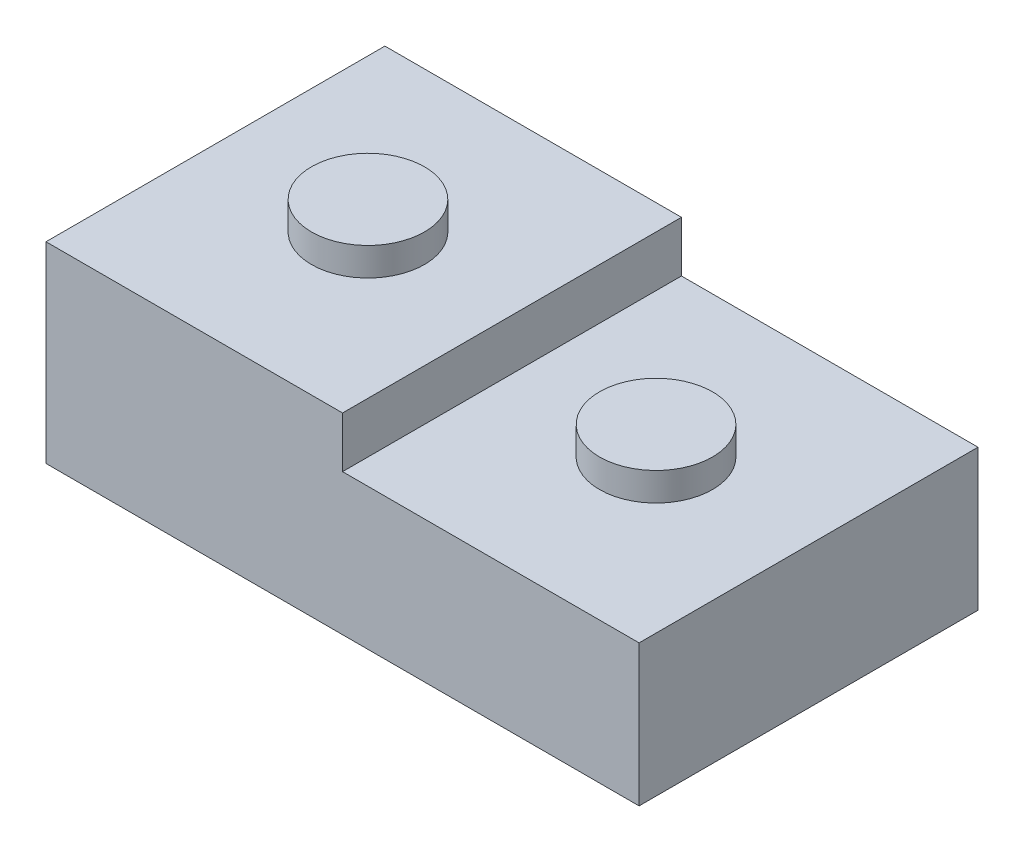
ISO-10303-21;
HEADER;
FILE_DESCRIPTION(('STEP AP214'),'2;1');
FILE_NAME('part.step','',(''),(''),'','','');
FILE_SCHEMA(('AUTOMOTIVE_DESIGN { 1 0 10303 214 1 1 1 1 }'));
ENDSEC;
DATA;
#1=APPLICATION_CONTEXT('core data for automotive mechanical design processes');
#2=APPLICATION_PROTOCOL_DEFINITION('international standard','automotive_design',2000,#1);
#3=PRODUCT_CONTEXT('',#1,'mechanical');
#4=PRODUCT('Part','Part','',(#3));
#5=PRODUCT_RELATED_PRODUCT_CATEGORY('part','',(#4));
#6=PRODUCT_DEFINITION_FORMATION('','',#4);
#7=PRODUCT_DEFINITION_CONTEXT('part definition',#1,'design');
#8=PRODUCT_DEFINITION('design','',#6,#7);
#9=PRODUCT_DEFINITION_SHAPE('','',#8);
#10=(LENGTH_UNIT() NAMED_UNIT(*) SI_UNIT(.MILLI.,.METRE.));
#11=(NAMED_UNIT(*) PLANE_ANGLE_UNIT() SI_UNIT($,.RADIAN.));
#12=(NAMED_UNIT(*) SI_UNIT($,.STERADIAN.) SOLID_ANGLE_UNIT());
#13=UNCERTAINTY_MEASURE_WITH_UNIT(LENGTH_MEASURE(1.E-05),#10,'distance_accuracy_value','');
#14=(GEOMETRIC_REPRESENTATION_CONTEXT(3) GLOBAL_UNCERTAINTY_ASSIGNED_CONTEXT((#13)) GLOBAL_UNIT_ASSIGNED_CONTEXT((#10,
#11,#12)) REPRESENTATION_CONTEXT('',''));
#15=CARTESIAN_POINT('',(0.,0.,0.));
#16=DIRECTION('',(0.,0.,1.));
#17=DIRECTION('',(1.,0.,0.));
#18=AXIS2_PLACEMENT_3D('',#15,#16,#17);
#19=CARTESIAN_POINT('',(105.,50.,-60.));
#20=DIRECTION('',(-1.,0.,0.));
#21=DIRECTION('',(0.,0.,1.));
#22=AXIS2_PLACEMENT_3D('',#19,#20,#21);
#23=PLANE('',#22);
#24=DIRECTION('',(0.,0.,-1.));
#25=VECTOR('',#24,1.);
#26=CARTESIAN_POINT('',(105.,0.,-60.));
#27=LINE('',#26,#25);
#28=CARTESIAN_POINT('',(105.,0.,60.));
#29=VERTEX_POINT('',#28);
#30=CARTESIAN_POINT('',(105.,0.,-60.));
#31=VERTEX_POINT('',#30);
#32=EDGE_CURVE('E96',#29,#31,#27,.T.);
#33=ORIENTED_EDGE('',*,*,#32,.T.);
#34=DIRECTION('',(0.,-1.,0.));
#35=VECTOR('',#34,1.);
#36=CARTESIAN_POINT('',(105.,50.,-60.));
#37=LINE('',#36,#35);
#38=CARTESIAN_POINT('',(105.,50.,-60.));
#39=VERTEX_POINT('',#38);
#40=EDGE_CURVE('E42',#39,#31,#37,.T.);
#41=ORIENTED_EDGE('',*,*,#40,.F.);
#42=DIRECTION('',(0.,0.,-1.));
#43=VECTOR('',#42,1.);
#44=CARTESIAN_POINT('',(105.,50.,-60.));
#45=LINE('',#44,#43);
#46=CARTESIAN_POINT('',(105.,50.,60.));
#47=VERTEX_POINT('',#46);
#48=EDGE_CURVE('E90',#47,#39,#45,.T.);
#49=ORIENTED_EDGE('',*,*,#48,.F.);
#50=DIRECTION('',(0.,-1.,0.));
#51=VECTOR('',#50,1.);
#52=CARTESIAN_POINT('',(105.,50.,60.));
#53=LINE('',#52,#51);
#54=EDGE_CURVE('E82',#47,#29,#53,.T.);
#55=ORIENTED_EDGE('',*,*,#54,.T.);
#56=EDGE_LOOP('',(#33,#41,#49,#55));
#57=FACE_BOUND('',#56,.T.);
#58=ADVANCED_FACE('F39',(#57),#23,.F.);
#59=CARTESIAN_POINT('',(-105.,50.,-60.));
#60=DIRECTION('',(0.,0.,1.));
#61=DIRECTION('',(1.,0.,0.));
#62=AXIS2_PLACEMENT_3D('',#59,#60,#61);
#63=PLANE('',#62);
#64=DIRECTION('',(-1.,0.,0.));
#65=VECTOR('',#64,1.);
#66=CARTESIAN_POINT('',(-105.,0.,-60.));
#67=LINE('',#66,#65);
#68=CARTESIAN_POINT('',(-105.,0.,-60.));
#69=VERTEX_POINT('',#68);
#70=EDGE_CURVE('E99',#31,#69,#67,.T.);
#71=ORIENTED_EDGE('',*,*,#70,.T.);
#72=DIRECTION('',(0.,-1.,0.));
#73=VECTOR('',#72,1.);
#74=CARTESIAN_POINT('',(-105.,50.,-60.));
#75=LINE('',#74,#73);
#76=CARTESIAN_POINT('',(-105.,68.,-60.));
#77=VERTEX_POINT('',#76);
#78=EDGE_CURVE('E111',#77,#69,#75,.T.);
#79=ORIENTED_EDGE('',*,*,#78,.F.);
#80=DIRECTION('',(-1.,0.,0.));
#81=VECTOR('',#80,1.);
#82=CARTESIAN_POINT('',(-105.,68.,-60.));
#83=LINE('',#82,#81);
#84=CARTESIAN_POINT('',(0.,68.,-60.));
#85=VERTEX_POINT('',#84);
#86=EDGE_CURVE('E127',#85,#77,#83,.T.);
#87=ORIENTED_EDGE('',*,*,#86,.F.);
#88=DIRECTION('',(0.,-1.,0.));
#89=VECTOR('',#88,1.);
#90=CARTESIAN_POINT('',(0.,68.,-60.));
#91=LINE('',#90,#89);
#92=CARTESIAN_POINT('',(0.,50.,-60.));
#93=VERTEX_POINT('',#92);
#94=EDGE_CURVE('E105',#85,#93,#91,.T.);
#95=ORIENTED_EDGE('',*,*,#94,.T.);
#96=DIRECTION('',(-1.,0.,0.));
#97=VECTOR('',#96,1.);
#98=CARTESIAN_POINT('',(-105.,50.,-60.));
#99=LINE('',#98,#97);
#100=EDGE_CURVE('E119',#39,#93,#99,.T.);
#101=ORIENTED_EDGE('',*,*,#100,.F.);
#102=ORIENTED_EDGE('',*,*,#40,.T.);
#103=EDGE_LOOP('',(#71,#79,#87,#95,#101,#102));
#104=FACE_BOUND('',#103,.T.);
#105=ADVANCED_FACE('F117',(#104),#63,.F.);
#106=CARTESIAN_POINT('',(-105.,50.,-60.));
#107=DIRECTION('',(1.,0.,0.));
#108=DIRECTION('',(0.,0.,-1.));
#109=AXIS2_PLACEMENT_3D('',#106,#107,#108);
#110=PLANE('',#109);
#111=DIRECTION('',(0.,0.,1.));
#112=VECTOR('',#111,1.);
#113=CARTESIAN_POINT('',(-105.,0.,-60.));
#114=LINE('',#113,#112);
#115=CARTESIAN_POINT('',(-105.,0.,60.));
#116=VERTEX_POINT('',#115);
#117=EDGE_CURVE('E91',#69,#116,#114,.T.);
#118=ORIENTED_EDGE('',*,*,#117,.T.);
#119=DIRECTION('',(0.,-1.,0.));
#120=VECTOR('',#119,1.);
#121=CARTESIAN_POINT('',(-105.,50.,60.));
#122=LINE('',#121,#120);
#123=CARTESIAN_POINT('',(-105.,68.,60.));
#124=VERTEX_POINT('',#123);
#125=EDGE_CURVE('E86',#124,#116,#122,.T.);
#126=ORIENTED_EDGE('',*,*,#125,.F.);
#127=DIRECTION('',(0.,0.,1.));
#128=VECTOR('',#127,1.);
#129=CARTESIAN_POINT('',(-105.,68.,-60.));
#130=LINE('',#129,#128);
#131=EDGE_CURVE('E129',#77,#124,#130,.T.);
#132=ORIENTED_EDGE('',*,*,#131,.F.);
#133=ORIENTED_EDGE('',*,*,#78,.T.);
#134=EDGE_LOOP('',(#118,#126,#132,#133));
#135=FACE_BOUND('',#134,.T.);
#136=ADVANCED_FACE('F168',(#135),#110,.F.);
#137=CARTESIAN_POINT('',(-105.,50.,60.));
#138=DIRECTION('',(0.,0.,-1.));
#139=DIRECTION('',(-1.,0.,0.));
#140=AXIS2_PLACEMENT_3D('',#137,#138,#139);
#141=PLANE('',#140);
#142=DIRECTION('',(1.,0.,0.));
#143=VECTOR('',#142,1.);
#144=CARTESIAN_POINT('',(-105.,0.,60.));
#145=LINE('',#144,#143);
#146=EDGE_CURVE('E79',#116,#29,#145,.T.);
#147=ORIENTED_EDGE('',*,*,#146,.T.);
#148=ORIENTED_EDGE('',*,*,#54,.F.);
#149=DIRECTION('',(1.,0.,0.));
#150=VECTOR('',#149,1.);
#151=CARTESIAN_POINT('',(-105.,50.,60.));
#152=LINE('',#151,#150);
#153=CARTESIAN_POINT('',(0.,50.,60.));
#154=VERTEX_POINT('',#153);
#155=EDGE_CURVE('E59',#154,#47,#152,.T.);
#156=ORIENTED_EDGE('',*,*,#155,.F.);
#157=DIRECTION('',(0.,-1.,0.));
#158=VECTOR('',#157,1.);
#159=CARTESIAN_POINT('',(0.,68.,60.));
#160=LINE('',#159,#158);
#161=CARTESIAN_POINT('',(0.,68.,60.));
#162=VERTEX_POINT('',#161);
#163=EDGE_CURVE('E101',#162,#154,#160,.T.);
#164=ORIENTED_EDGE('',*,*,#163,.F.);
#165=DIRECTION('',(1.,0.,0.));
#166=VECTOR('',#165,1.);
#167=CARTESIAN_POINT('',(-105.,68.,60.));
#168=LINE('',#167,#166);
#169=EDGE_CURVE('E136',#124,#162,#168,.T.);
#170=ORIENTED_EDGE('',*,*,#169,.F.);
#171=ORIENTED_EDGE('',*,*,#125,.T.);
#172=EDGE_LOOP('',(#147,#148,#156,#164,#170,#171));
#173=FACE_BOUND('',#172,.T.);
#174=ADVANCED_FACE('F81',(#173),#141,.F.);
#175=CARTESIAN_POINT('',(0.,50.,0.));
#176=DIRECTION('',(0.,1.,0.));
#177=DIRECTION('',(0.,0.,1.));
#178=AXIS2_PLACEMENT_3D('',#175,#176,#177);
#179=PLANE('',#178);
#180=CARTESIAN_POINT('',(51.,50.,0.));
#181=DIRECTION('',(0.,1.,0.));
#182=DIRECTION('',(0.,0.,1.));
#183=AXIS2_PLACEMENT_3D('',#180,#181,#182);
#184=CIRCLE('',#183,20.);
#185=CARTESIAN_POINT('',(51.,50.,20.));
#186=VERTEX_POINT('',#185);
#187=EDGE_CURVE('E144',#186,#186,#184,.T.);
#188=ORIENTED_EDGE('',*,*,#187,.F.);
#189=EDGE_LOOP('',(#188));
#190=FACE_BOUND('',#189,.T.);
#191=DIRECTION('',(0.,0.,-1.));
#192=VECTOR('',#191,1.);
#193=CARTESIAN_POINT('',(0.,50.,-60.));
#194=LINE('',#193,#192);
#195=EDGE_CURVE('E54',#154,#93,#194,.T.);
#196=ORIENTED_EDGE('',*,*,#195,.F.);
#197=ORIENTED_EDGE('',*,*,#155,.T.);
#198=ORIENTED_EDGE('',*,*,#48,.T.);
#199=ORIENTED_EDGE('',*,*,#100,.T.);
#200=EDGE_LOOP('',(#196,#197,#198,#199));
#201=FACE_BOUND('',#200,.T.);
#202=ADVANCED_FACE('F123',(#190,#201),#179,.T.);
#203=CARTESIAN_POINT('',(0.,0.,0.));
#204=DIRECTION('',(0.,1.,0.));
#205=DIRECTION('',(0.,0.,1.));
#206=AXIS2_PLACEMENT_3D('',#203,#204,#205);
#207=PLANE('',#206);
#208=ORIENTED_EDGE('',*,*,#32,.F.);
#209=ORIENTED_EDGE('',*,*,#146,.F.);
#210=ORIENTED_EDGE('',*,*,#117,.F.);
#211=ORIENTED_EDGE('',*,*,#70,.F.);
#212=EDGE_LOOP('',(#208,#209,#210,#211));
#213=FACE_BOUND('',#212,.T.);
#214=ADVANCED_FACE('F98',(#213),#207,.F.);
#215=CARTESIAN_POINT('',(0.,68.,-60.));
#216=DIRECTION('',(-1.,0.,0.));
#217=DIRECTION('',(0.,0.,1.));
#218=AXIS2_PLACEMENT_3D('',#215,#216,#217);
#219=PLANE('',#218);
#220=ORIENTED_EDGE('',*,*,#195,.T.);
#221=ORIENTED_EDGE('',*,*,#94,.F.);
#222=DIRECTION('',(0.,0.,-1.));
#223=VECTOR('',#222,1.);
#224=CARTESIAN_POINT('',(0.,68.,-60.));
#225=LINE('',#224,#223);
#226=EDGE_CURVE('E133',#162,#85,#225,.T.);
#227=ORIENTED_EDGE('',*,*,#226,.F.);
#228=ORIENTED_EDGE('',*,*,#163,.T.);
#229=EDGE_LOOP('',(#220,#221,#227,#228));
#230=FACE_BOUND('',#229,.T.);
#231=ADVANCED_FACE('F165',(#230),#219,.F.);
#232=CARTESIAN_POINT('',(0.,68.,0.));
#233=DIRECTION('',(0.,1.,0.));
#234=DIRECTION('',(0.,0.,1.));
#235=AXIS2_PLACEMENT_3D('',#232,#233,#234);
#236=PLANE('',#235);
#237=CARTESIAN_POINT('',(-51.,68.,0.));
#238=DIRECTION('',(0.,1.,0.));
#239=DIRECTION('',(0.,0.,1.));
#240=AXIS2_PLACEMENT_3D('',#237,#238,#239);
#241=CIRCLE('',#240,20.);
#242=CARTESIAN_POINT('',(-51.,68.,20.));
#243=VERTEX_POINT('',#242);
#244=EDGE_CURVE('E11',#243,#243,#241,.T.);
#245=ORIENTED_EDGE('',*,*,#244,.F.);
#246=EDGE_LOOP('',(#245));
#247=FACE_BOUND('',#246,.T.);
#248=ORIENTED_EDGE('',*,*,#131,.T.);
#249=ORIENTED_EDGE('',*,*,#169,.T.);
#250=ORIENTED_EDGE('',*,*,#226,.T.);
#251=ORIENTED_EDGE('',*,*,#86,.T.);
#252=EDGE_LOOP('',(#248,#249,#250,#251));
#253=FACE_BOUND('',#252,.T.);
#254=ADVANCED_FACE('F187',(#247,#253),#236,.T.);
#255=CARTESIAN_POINT('',(-51.,78.,0.));
#256=DIRECTION('',(0.,-1.,0.));
#257=DIRECTION('',(0.,0.,-1.));
#258=AXIS2_PLACEMENT_3D('',#255,#256,#257);
#259=CYLINDRICAL_SURFACE('',#258,20.);
#260=CARTESIAN_POINT('',(-51.,78.,0.));
#261=DIRECTION('',(0.,1.,0.));
#262=DIRECTION('',(0.,0.,1.));
#263=AXIS2_PLACEMENT_3D('',#260,#261,#262);
#264=CIRCLE('',#263,20.);
#265=CARTESIAN_POINT('',(-51.,78.,20.));
#266=VERTEX_POINT('',#265);
#267=EDGE_CURVE('E130',#266,#266,#264,.T.);
#268=ORIENTED_EDGE('',*,*,#267,.F.);
#269=EDGE_LOOP('',(#268));
#270=FACE_BOUND('',#269,.T.);
#271=ORIENTED_EDGE('',*,*,#244,.T.);
#272=EDGE_LOOP('',(#271));
#273=FACE_BOUND('',#272,.T.);
#274=ADVANCED_FACE('F197',(#270,#273),#259,.T.);
#275=CARTESIAN_POINT('',(-51.,78.,0.));
#276=DIRECTION('',(0.,1.,0.));
#277=DIRECTION('',(0.,0.,1.));
#278=AXIS2_PLACEMENT_3D('',#275,#276,#277);
#279=PLANE('',#278);
#280=ORIENTED_EDGE('',*,*,#267,.T.);
#281=EDGE_LOOP('',(#280));
#282=FACE_BOUND('',#281,.T.);
#283=ADVANCED_FACE('F155',(#282),#279,.T.);
#284=CARTESIAN_POINT('',(51.,60.,0.));
#285=DIRECTION('',(0.,-1.,0.));
#286=DIRECTION('',(0.,0.,-1.));
#287=AXIS2_PLACEMENT_3D('',#284,#285,#286);
#288=CYLINDRICAL_SURFACE('',#287,20.);
#289=CARTESIAN_POINT('',(51.,60.,0.));
#290=DIRECTION('',(0.,1.,0.));
#291=DIRECTION('',(0.,0.,1.));
#292=AXIS2_PLACEMENT_3D('',#289,#290,#291);
#293=CIRCLE('',#292,20.);
#294=CARTESIAN_POINT('',(51.,60.,20.));
#295=VERTEX_POINT('',#294);
#296=EDGE_CURVE('E143',#295,#295,#293,.T.);
#297=ORIENTED_EDGE('',*,*,#296,.F.);
#298=EDGE_LOOP('',(#297));
#299=FACE_BOUND('',#298,.T.);
#300=ORIENTED_EDGE('',*,*,#187,.T.);
#301=EDGE_LOOP('',(#300));
#302=FACE_BOUND('',#301,.T.);
#303=ADVANCED_FACE('F152',(#299,#302),#288,.T.);
#304=CARTESIAN_POINT('',(51.,60.,0.));
#305=DIRECTION('',(0.,1.,0.));
#306=DIRECTION('',(0.,0.,1.));
#307=AXIS2_PLACEMENT_3D('',#304,#305,#306);
#308=PLANE('',#307);
#309=ORIENTED_EDGE('',*,*,#296,.T.);
#310=EDGE_LOOP('',(#309));
#311=FACE_BOUND('',#310,.T.);
#312=ADVANCED_FACE('F150',(#311),#308,.T.);
#313=CLOSED_SHELL('',(#58,#105,#136,#174,#202,#214,#231,#254,#274,#283,#303,#312));
#314=MANIFOLD_SOLID_BREP('B2',#313);
#315=ADVANCED_BREP_SHAPE_REPRESENTATION('',(#18,#314),#14);
#316=SHAPE_DEFINITION_REPRESENTATION(#9,#315);
ENDSEC;
END-ISO-10303-21;
